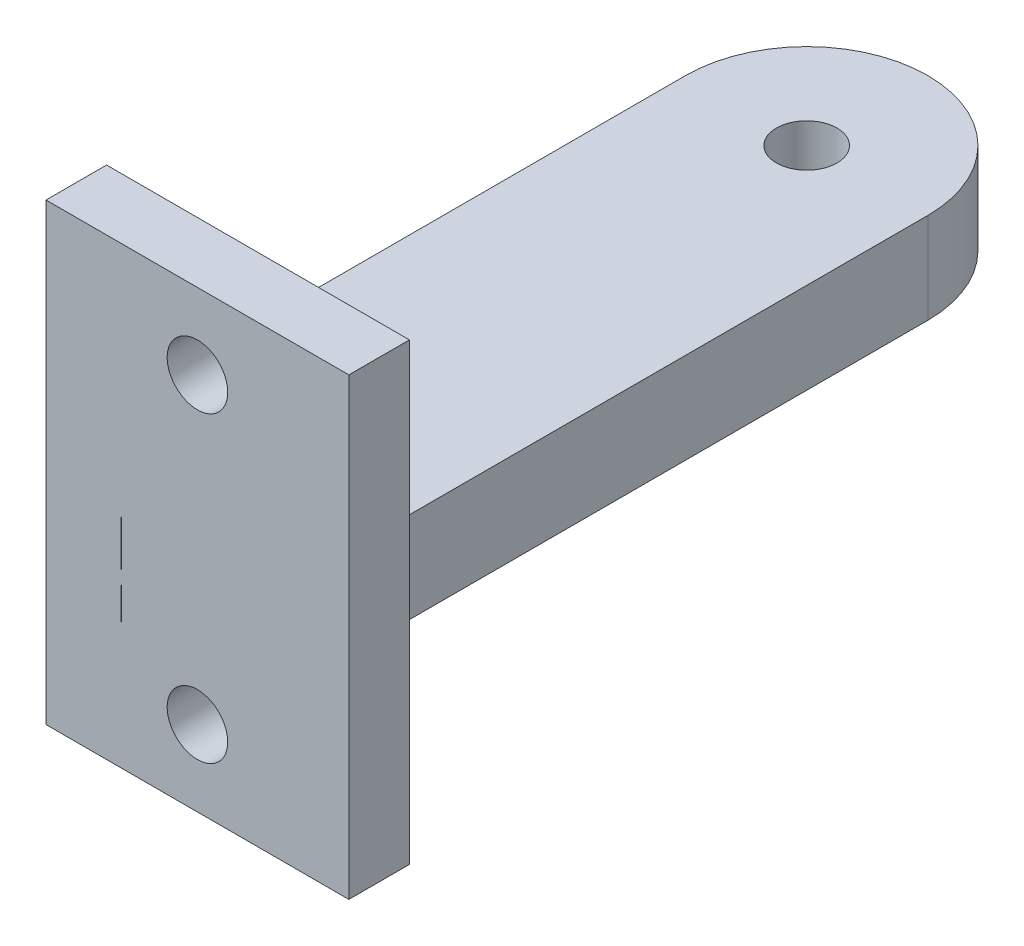
ISO-10303-21;
HEADER;
FILE_DESCRIPTION(('STEP AP214'),'2;1');
FILE_NAME('part.step','',(''),(''),'','','');
FILE_SCHEMA(('AUTOMOTIVE_DESIGN { 1 0 10303 214 1 1 1 1 }'));
ENDSEC;
DATA;
#1=APPLICATION_CONTEXT('core data for automotive mechanical design processes');
#2=APPLICATION_PROTOCOL_DEFINITION('international standard','automotive_design',2000,#1);
#3=PRODUCT_CONTEXT('',#1,'mechanical');
#4=PRODUCT('Part','Part','',(#3));
#5=PRODUCT_RELATED_PRODUCT_CATEGORY('part','',(#4));
#6=PRODUCT_DEFINITION_FORMATION('','',#4);
#7=PRODUCT_DEFINITION_CONTEXT('part definition',#1,'design');
#8=PRODUCT_DEFINITION('design','',#6,#7);
#9=PRODUCT_DEFINITION_SHAPE('','',#8);
#10=(LENGTH_UNIT() NAMED_UNIT(*) SI_UNIT(.MILLI.,.METRE.));
#11=(NAMED_UNIT(*) PLANE_ANGLE_UNIT() SI_UNIT($,.RADIAN.));
#12=(NAMED_UNIT(*) SI_UNIT($,.STERADIAN.) SOLID_ANGLE_UNIT());
#13=UNCERTAINTY_MEASURE_WITH_UNIT(LENGTH_MEASURE(1.E-05),#10,'distance_accuracy_value','');
#14=(GEOMETRIC_REPRESENTATION_CONTEXT(3) GLOBAL_UNCERTAINTY_ASSIGNED_CONTEXT((#13)) GLOBAL_UNIT_ASSIGNED_CONTEXT((#10,
#11,#12)) REPRESENTATION_CONTEXT('',''));
#15=CARTESIAN_POINT('',(0.,0.,0.));
#16=DIRECTION('',(0.,0.,1.));
#17=DIRECTION('',(1.,0.,0.));
#18=AXIS2_PLACEMENT_3D('',#15,#16,#17);
#19=CARTESIAN_POINT('',(0.,-3.,-0.233913739434797));
#20=DIRECTION('',(0.,1.,0.));
#21=DIRECTION('',(0.,0.,1.));
#22=AXIS2_PLACEMENT_3D('',#19,#20,#21);
#23=CYLINDRICAL_SURFACE('',#22,8.);
#24=DIRECTION('',(0.,1.,0.));
#25=VECTOR('',#24,1.);
#26=CARTESIAN_POINT('',(-1.36862294810169,-3.,7.64814634825354));
#27=LINE('',#26,#25);
#28=CARTESIAN_POINT('',(-1.36862294810169,-3.,7.64814634825354));
#29=VERTEX_POINT('',#28);
#30=CARTESIAN_POINT('',(-1.38161427696113,0.,7.64586849273672));
#31=VERTEX_POINT('',#30);
#32=EDGE_CURVE('E57',#29,#31,#27,.T.);
#33=ORIENTED_EDGE('',*,*,#32,.T.);
#34=DIRECTION('',(0.,1.,0.));
#35=VECTOR('',#34,1.);
#36=CARTESIAN_POINT('',(-1.39460560582057,-3.,7.6435906372199));
#37=LINE('',#36,#35);
#38=CARTESIAN_POINT('',(-1.39460560582057,-3.,7.6435906372199));
#39=VERTEX_POINT('',#38);
#40=EDGE_CURVE('E12',#39,#31,#37,.T.);
#41=ORIENTED_EDGE('',*,*,#40,.F.);
#42=CARTESIAN_POINT('',(0.,-3.,-0.233913739434797));
#43=DIRECTION('',(0.,1.,0.));
#44=DIRECTION('',(0.,0.,1.));
#45=AXIS2_PLACEMENT_3D('',#42,#43,#44);
#46=CIRCLE('',#45,8.);
#47=EDGE_CURVE('E69',#39,#29,#46,.T.);
#48=ORIENTED_EDGE('',*,*,#47,.T.);
#49=EDGE_LOOP('',(#33,#41,#48));
#50=FACE_BOUND('',#49,.T.);
#51=ADVANCED_FACE('F48',(#50),#23,.T.);
#52=CARTESIAN_POINT('',(-1.36862294810169,-3.,7.64814634825354));
#53=DIRECTION('',(0.172702019337558,0.,-0.984974117688749));
#54=DIRECTION('',(-0.984974117688749,0.,-0.172702019337558));
#55=AXIS2_PLACEMENT_3D('',#52,#53,#54);
#56=PLANE('',#55);
#57=ORIENTED_EDGE('',*,*,#40,.T.);
#58=ORIENTED_EDGE('',*,*,#32,.F.);
#59=DIRECTION('',(-0.984974117688749,0.,-0.172702019337558));
#60=VECTOR('',#59,1.);
#61=CARTESIAN_POINT('',(-1.36862294810169,-3.,7.64814634825354));
#62=LINE('',#61,#60);
#63=EDGE_CURVE('E71',#29,#39,#62,.T.);
#64=ORIENTED_EDGE('',*,*,#63,.T.);
#65=EDGE_LOOP('',(#57,#58,#64));
#66=FACE_BOUND('',#65,.T.);
#67=ADVANCED_FACE('F72',(#66),#56,.T.);
#68=CARTESIAN_POINT('',(0.,-3.,-0.233913739434797));
#69=DIRECTION('',(0.,1.,0.));
#70=DIRECTION('',(0.,0.,1.));
#71=AXIS2_PLACEMENT_3D('',#68,#69,#70);
#72=PLANE('',#71);
#73=ORIENTED_EDGE('',*,*,#47,.F.);
#74=ORIENTED_EDGE('',*,*,#63,.F.);
#75=EDGE_LOOP('',(#73,#74));
#76=FACE_BOUND('',#75,.T.);
#77=ADVANCED_FACE('F78',(#76),#72,.F.);
#78=CLOSED_SHELL('',(#51,#67,#77));
#79=MANIFOLD_SOLID_BREP('B2',#78);
#80=CARTESIAN_POINT('',(-8.,-3.,-0.233913739434797));
#81=DIRECTION('',(0.,0.,1.));
#82=DIRECTION('',(1.,0.,0.));
#83=AXIS2_PLACEMENT_3D('',#80,#81,#82);
#84=PLANE('',#83);
#85=DIRECTION('',(0.,1.,0.));
#86=VECTOR('',#85,1.);
#87=CARTESIAN_POINT('',(8.,-3.,-0.233913739434797));
#88=LINE('',#87,#86);
#89=CARTESIAN_POINT('',(8.,-3.,-0.233913739434797));
#90=VERTEX_POINT('',#89);
#91=CARTESIAN_POINT('',(8.,3.,-0.233913739434797));
#92=VERTEX_POINT('',#91);
#93=EDGE_CURVE('E117',#90,#92,#88,.T.);
#94=ORIENTED_EDGE('',*,*,#93,.T.);
#95=DIRECTION('',(1.,0.,0.));
#96=VECTOR('',#95,1.);
#97=CARTESIAN_POINT('',(-8.,3.,-0.233913739434797));
#98=LINE('',#97,#96);
#99=CARTESIAN_POINT('',(-8.,3.,-0.233913739434797));
#100=VERTEX_POINT('',#99);
#101=EDGE_CURVE('E154',#100,#92,#98,.T.);
#102=ORIENTED_EDGE('',*,*,#101,.F.);
#103=DIRECTION('',(0.,1.,0.));
#104=VECTOR('',#103,1.);
#105=CARTESIAN_POINT('',(-8.,-3.,-0.233913739434797));
#106=LINE('',#105,#104);
#107=CARTESIAN_POINT('',(-8.,-3.,-0.233913739434797));
#108=VERTEX_POINT('',#107);
#109=EDGE_CURVE('E46',#108,#100,#106,.T.);
#110=ORIENTED_EDGE('',*,*,#109,.F.);
#111=DIRECTION('',(1.,0.,0.));
#112=VECTOR('',#111,1.);
#113=CARTESIAN_POINT('',(-8.,-3.,-0.233913739434797));
#114=LINE('',#113,#112);
#115=EDGE_CURVE('E155',#108,#90,#114,.T.);
#116=ORIENTED_EDGE('',*,*,#115,.T.);
#117=EDGE_LOOP('',(#94,#102,#110,#116));
#118=FACE_BOUND('',#117,.T.);
#119=ADVANCED_FACE('F114',(#118),#84,.T.);
#120=CARTESIAN_POINT('',(-8.,-3.,-0.233913739434797));
#121=DIRECTION('',(-1.,0.,0.));
#122=DIRECTION('',(0.,0.,1.));
#123=AXIS2_PLACEMENT_3D('',#120,#121,#122);
#124=PLANE('',#123);
#125=ORIENTED_EDGE('',*,*,#109,.T.);
#126=DIRECTION('',(0.,0.,1.));
#127=VECTOR('',#126,1.);
#128=CARTESIAN_POINT('',(-8.,3.,-0.233913739434797));
#129=LINE('',#128,#127);
#130=CARTESIAN_POINT('',(-8.,3.,-36.2339137394348));
#131=VERTEX_POINT('',#130);
#132=EDGE_CURVE('E171',#131,#100,#129,.T.);
#133=ORIENTED_EDGE('',*,*,#132,.F.);
#134=DIRECTION('',(0.,1.,0.));
#135=VECTOR('',#134,1.);
#136=CARTESIAN_POINT('',(-8.,-3.,-36.2339137394348));
#137=LINE('',#136,#135);
#138=CARTESIAN_POINT('',(-8.,-3.,-36.2339137394348));
#139=VERTEX_POINT('',#138);
#140=EDGE_CURVE('E122',#139,#131,#137,.T.);
#141=ORIENTED_EDGE('',*,*,#140,.F.);
#142=DIRECTION('',(0.,0.,1.));
#143=VECTOR('',#142,1.);
#144=CARTESIAN_POINT('',(-8.,-3.,-0.233913739434797));
#145=LINE('',#144,#143);
#146=EDGE_CURVE('E160',#139,#108,#145,.T.);
#147=ORIENTED_EDGE('',*,*,#146,.T.);
#148=EDGE_LOOP('',(#125,#133,#141,#147));
#149=FACE_BOUND('',#148,.T.);
#150=ADVANCED_FACE('F191',(#149),#124,.T.);
#151=CARTESIAN_POINT('',(0.,-3.,-36.2339137394348));
#152=DIRECTION('',(0.,1.,0.));
#153=DIRECTION('',(0.,0.,1.));
#154=AXIS2_PLACEMENT_3D('',#151,#152,#153);
#155=CYLINDRICAL_SURFACE('',#154,8.);
#156=ORIENTED_EDGE('',*,*,#140,.T.);
#157=CARTESIAN_POINT('',(0.,3.,-36.2339137394348));
#158=DIRECTION('',(0.,1.,0.));
#159=DIRECTION('',(0.,0.,1.));
#160=AXIS2_PLACEMENT_3D('',#157,#158,#159);
#161=CIRCLE('',#160,8.);
#162=CARTESIAN_POINT('',(8.,3.,-36.2339137394348));
#163=VERTEX_POINT('',#162);
#164=EDGE_CURVE('E167',#163,#131,#161,.T.);
#165=ORIENTED_EDGE('',*,*,#164,.F.);
#166=DIRECTION('',(0.,1.,0.));
#167=VECTOR('',#166,1.);
#168=CARTESIAN_POINT('',(8.,-3.,-36.2339137394348));
#169=LINE('',#168,#167);
#170=CARTESIAN_POINT('',(8.,-3.,-36.2339137394348));
#171=VERTEX_POINT('',#170);
#172=EDGE_CURVE('E159',#171,#163,#169,.T.);
#173=ORIENTED_EDGE('',*,*,#172,.F.);
#174=CARTESIAN_POINT('',(0.,-3.,-36.2339137394348));
#175=DIRECTION('',(0.,1.,0.));
#176=DIRECTION('',(0.,0.,1.));
#177=AXIS2_PLACEMENT_3D('',#174,#175,#176);
#178=CIRCLE('',#177,8.);
#179=EDGE_CURVE('E184',#171,#139,#178,.T.);
#180=ORIENTED_EDGE('',*,*,#179,.T.);
#181=EDGE_LOOP('',(#156,#165,#173,#180));
#182=FACE_BOUND('',#181,.T.);
#183=ADVANCED_FACE('F188',(#182),#155,.T.);
#184=CARTESIAN_POINT('',(8.,-3.,-0.233913739434797));
#185=DIRECTION('',(1.,0.,0.));
#186=DIRECTION('',(0.,0.,-1.));
#187=AXIS2_PLACEMENT_3D('',#184,#185,#186);
#188=PLANE('',#187);
#189=ORIENTED_EDGE('',*,*,#172,.T.);
#190=DIRECTION('',(0.,0.,-1.));
#191=VECTOR('',#190,1.);
#192=CARTESIAN_POINT('',(8.,3.,-0.233913739434797));
#193=LINE('',#192,#191);
#194=EDGE_CURVE('E162',#92,#163,#193,.T.);
#195=ORIENTED_EDGE('',*,*,#194,.F.);
#196=ORIENTED_EDGE('',*,*,#93,.F.);
#197=DIRECTION('',(0.,0.,-1.));
#198=VECTOR('',#197,1.);
#199=CARTESIAN_POINT('',(8.,-3.,-0.233913739434797));
#200=LINE('',#199,#198);
#201=EDGE_CURVE('E182',#90,#171,#200,.T.);
#202=ORIENTED_EDGE('',*,*,#201,.T.);
#203=EDGE_LOOP('',(#189,#195,#196,#202));
#204=FACE_BOUND('',#203,.T.);
#205=ADVANCED_FACE('F163',(#204),#188,.T.);
#206=CARTESIAN_POINT('',(0.,-3.,-36.2339137394348));
#207=DIRECTION('',(0.,1.,0.));
#208=DIRECTION('',(0.,0.,1.));
#209=AXIS2_PLACEMENT_3D('',#206,#207,#208);
#210=PLANE('',#209);
#211=CARTESIAN_POINT('',(0.,-3.,-36.2339137394348));
#212=DIRECTION('',(0.,1.,0.));
#213=DIRECTION('',(0.,0.,1.));
#214=AXIS2_PLACEMENT_3D('',#211,#212,#213);
#215=CIRCLE('',#214,2.);
#216=CARTESIAN_POINT('',(0.,-3.,-34.2339137394348));
#217=VERTEX_POINT('',#216);
#218=EDGE_CURVE('E172',#217,#217,#215,.T.);
#219=ORIENTED_EDGE('',*,*,#218,.T.);
#220=EDGE_LOOP('',(#219));
#221=FACE_BOUND('',#220,.T.);
#222=ORIENTED_EDGE('',*,*,#115,.F.);
#223=ORIENTED_EDGE('',*,*,#146,.F.);
#224=ORIENTED_EDGE('',*,*,#179,.F.);
#225=ORIENTED_EDGE('',*,*,#201,.F.);
#226=EDGE_LOOP('',(#222,#223,#224,#225));
#227=FACE_BOUND('',#226,.T.);
#228=ADVANCED_FACE('F193',(#221,#227),#210,.F.);
#229=CARTESIAN_POINT('',(0.,3.,-36.2339137394348));
#230=DIRECTION('',(0.,1.,0.));
#231=DIRECTION('',(0.,0.,1.));
#232=AXIS2_PLACEMENT_3D('',#229,#230,#231);
#233=PLANE('',#232);
#234=CARTESIAN_POINT('',(0.,3.,-36.2339137394348));
#235=DIRECTION('',(0.,1.,0.));
#236=DIRECTION('',(0.,0.,1.));
#237=AXIS2_PLACEMENT_3D('',#234,#235,#236);
#238=CIRCLE('',#237,2.);
#239=CARTESIAN_POINT('',(0.,3.,-34.2339137394348));
#240=VERTEX_POINT('',#239);
#241=EDGE_CURVE('E175',#240,#240,#238,.T.);
#242=ORIENTED_EDGE('',*,*,#241,.F.);
#243=EDGE_LOOP('',(#242));
#244=FACE_BOUND('',#243,.T.);
#245=ORIENTED_EDGE('',*,*,#101,.T.);
#246=ORIENTED_EDGE('',*,*,#194,.T.);
#247=ORIENTED_EDGE('',*,*,#164,.T.);
#248=ORIENTED_EDGE('',*,*,#132,.T.);
#249=EDGE_LOOP('',(#245,#246,#247,#248));
#250=FACE_BOUND('',#249,.T.);
#251=ADVANCED_FACE('F170',(#244,#250),#233,.T.);
#252=CARTESIAN_POINT('',(0.,-15.,-36.2339137394348));
#253=DIRECTION('',(0.,1.,0.));
#254=DIRECTION('',(0.,0.,1.));
#255=AXIS2_PLACEMENT_3D('',#252,#253,#254);
#256=CYLINDRICAL_SURFACE('',#255,2.);
#257=ORIENTED_EDGE('',*,*,#241,.T.);
#258=EDGE_LOOP('',(#257));
#259=FACE_BOUND('',#258,.T.);
#260=ORIENTED_EDGE('',*,*,#218,.F.);
#261=EDGE_LOOP('',(#260));
#262=FACE_BOUND('',#261,.T.);
#263=ADVANCED_FACE('F201',(#259,#262),#256,.F.);
#264=CLOSED_SHELL('',(#119,#150,#183,#205,#228,#251,#263));
#265=MANIFOLD_SOLID_BREP('B6',#264);
#266=CARTESIAN_POINT('',(0.,3.,-0.233913739434797));
#267=DIRECTION('',(0.,-1.,0.));
#268=DIRECTION('',(0.,0.,-1.));
#269=AXIS2_PLACEMENT_3D('',#266,#267,#268);
#270=CYLINDRICAL_SURFACE('',#269,8.);
#271=CARTESIAN_POINT('',(0.,0.,-0.233913739434797));
#272=DIRECTION('',(0.,1.,0.));
#273=DIRECTION('',(0.,0.,1.));
#274=AXIS2_PLACEMENT_3D('',#271,#272,#273);
#275=CIRCLE('',#274,8.);
#276=CARTESIAN_POINT('',(-1.39460560582057,0.,7.6435906372199));
#277=VERTEX_POINT('',#276);
#278=CARTESIAN_POINT('',(-1.36862294810169,0.,7.64814634825354));
#279=VERTEX_POINT('',#278);
#280=EDGE_CURVE('E299',#277,#279,#275,.T.);
#281=ORIENTED_EDGE('',*,*,#280,.T.);
#282=DIRECTION('',(0.,-1.,0.));
#283=VECTOR('',#282,1.);
#284=CARTESIAN_POINT('',(-1.36862294810169,3.,7.64814634825354));
#285=LINE('',#284,#283);
#286=CARTESIAN_POINT('',(-1.36862294810169,3.,7.64814634825354));
#287=VERTEX_POINT('',#286);
#288=EDGE_CURVE('E112',#287,#279,#285,.T.);
#289=ORIENTED_EDGE('',*,*,#288,.F.);
#290=CARTESIAN_POINT('',(0.,3.,-0.233913739434797));
#291=DIRECTION('',(0.,1.,0.));
#292=DIRECTION('',(0.,0.,1.));
#293=AXIS2_PLACEMENT_3D('',#290,#291,#292);
#294=CIRCLE('',#293,8.);
#295=CARTESIAN_POINT('',(-1.39460560582057,3.,7.6435906372199));
#296=VERTEX_POINT('',#295);
#297=EDGE_CURVE('E298',#296,#287,#294,.T.);
#298=ORIENTED_EDGE('',*,*,#297,.F.);
#299=DIRECTION('',(0.,-1.,0.));
#300=VECTOR('',#299,1.);
#301=CARTESIAN_POINT('',(-1.39460560582057,3.,7.6435906372199));
#302=LINE('',#301,#300);
#303=EDGE_CURVE('E276',#296,#277,#302,.T.);
#304=ORIENTED_EDGE('',*,*,#303,.T.);
#305=EDGE_LOOP('',(#281,#289,#298,#304));
#306=FACE_BOUND('',#305,.T.);
#307=ADVANCED_FACE('F268',(#306),#270,.T.);
#308=CARTESIAN_POINT('',(-1.36862294810169,3.,7.64814634825354));
#309=DIRECTION('',(-0.172702019337558,0.,0.984974117688749));
#310=DIRECTION('',(0.984974117688749,0.,0.172702019337558));
#311=AXIS2_PLACEMENT_3D('',#308,#309,#310);
#312=PLANE('',#311);
#313=DIRECTION('',(-0.984974117688749,0.,-0.172702019337558));
#314=VECTOR('',#313,1.);
#315=CARTESIAN_POINT('',(-1.36862294810169,0.,7.64814634825354));
#316=LINE('',#315,#314);
#317=EDGE_CURVE('E291',#279,#277,#316,.T.);
#318=ORIENTED_EDGE('',*,*,#317,.T.);
#319=ORIENTED_EDGE('',*,*,#303,.F.);
#320=DIRECTION('',(-0.984974117688749,0.,-0.172702019337558));
#321=VECTOR('',#320,1.);
#322=CARTESIAN_POINT('',(-1.36862294810169,3.,7.64814634825354));
#323=LINE('',#322,#321);
#324=EDGE_CURVE('E283',#287,#296,#323,.T.);
#325=ORIENTED_EDGE('',*,*,#324,.F.);
#326=ORIENTED_EDGE('',*,*,#288,.T.);
#327=EDGE_LOOP('',(#318,#319,#325,#326));
#328=FACE_BOUND('',#327,.T.);
#329=ADVANCED_FACE('F294',(#328),#312,.F.);
#330=CARTESIAN_POINT('',(0.,3.,-0.233913739434797));
#331=DIRECTION('',(0.,1.,0.));
#332=DIRECTION('',(0.,0.,1.));
#333=AXIS2_PLACEMENT_3D('',#330,#331,#332);
#334=PLANE('',#333);
#335=ORIENTED_EDGE('',*,*,#297,.T.);
#336=ORIENTED_EDGE('',*,*,#324,.T.);
#337=EDGE_LOOP('',(#335,#336));
#338=FACE_BOUND('',#337,.T.);
#339=ADVANCED_FACE('F306',(#338),#334,.T.);
#340=CARTESIAN_POINT('',(0.,0.,-0.233913739434797));
#341=DIRECTION('',(0.,1.,0.));
#342=DIRECTION('',(0.,0.,1.));
#343=AXIS2_PLACEMENT_3D('',#340,#341,#342);
#344=PLANE('',#343);
#345=ORIENTED_EDGE('',*,*,#280,.F.);
#346=ORIENTED_EDGE('',*,*,#317,.F.);
#347=EDGE_LOOP('',(#345,#346));
#348=FACE_BOUND('',#347,.T.);
#349=ADVANCED_FACE('F302',(#348),#344,.F.);
#350=CLOSED_SHELL('',(#307,#329,#339,#349));
#351=MANIFOLD_SOLID_BREP('B40',#350);
#352=CARTESIAN_POINT('',(10.,15.,4.));
#353=DIRECTION('',(-1.,0.,0.));
#354=DIRECTION('',(0.,-1.,0.));
#355=AXIS2_PLACEMENT_3D('',#352,#353,#354);
#356=PLANE('',#355);
#357=DIRECTION('',(0.,1.,0.));
#358=VECTOR('',#357,1.);
#359=CARTESIAN_POINT('',(10.,15.,0.));
#360=LINE('',#359,#358);
#361=CARTESIAN_POINT('',(10.,-15.,0.));
#362=VERTEX_POINT('',#361);
#363=CARTESIAN_POINT('',(10.,15.,0.));
#364=VERTEX_POINT('',#363);
#365=EDGE_CURVE('E403',#362,#364,#360,.T.);
#366=ORIENTED_EDGE('',*,*,#365,.T.);
#367=DIRECTION('',(0.,0.,-1.));
#368=VECTOR('',#367,1.);
#369=CARTESIAN_POINT('',(10.,15.,4.));
#370=LINE('',#369,#368);
#371=CARTESIAN_POINT('',(10.,15.,4.));
#372=VERTEX_POINT('',#371);
#373=EDGE_CURVE('E266',#372,#364,#370,.T.);
#374=ORIENTED_EDGE('',*,*,#373,.F.);
#375=DIRECTION('',(0.,1.,0.));
#376=VECTOR('',#375,1.);
#377=CARTESIAN_POINT('',(10.,15.,4.));
#378=LINE('',#377,#376);
#379=CARTESIAN_POINT('',(10.,-15.,4.));
#380=VERTEX_POINT('',#379);
#381=EDGE_CURVE('E391',#380,#372,#378,.T.);
#382=ORIENTED_EDGE('',*,*,#381,.F.);
#383=DIRECTION('',(0.,0.,-1.));
#384=VECTOR('',#383,1.);
#385=CARTESIAN_POINT('',(10.,-15.,4.));
#386=LINE('',#385,#384);
#387=EDGE_CURVE('E399',#380,#362,#386,.T.);
#388=ORIENTED_EDGE('',*,*,#387,.T.);
#389=EDGE_LOOP('',(#366,#374,#382,#388));
#390=FACE_BOUND('',#389,.T.);
#391=ADVANCED_FACE('F340',(#390),#356,.F.);
#392=CARTESIAN_POINT('',(-10.,15.,4.));
#393=DIRECTION('',(0.,-1.,0.));
#394=DIRECTION('',(0.,0.,-1.));
#395=AXIS2_PLACEMENT_3D('',#392,#393,#394);
#396=PLANE('',#395);
#397=DIRECTION('',(-1.,0.,0.));
#398=VECTOR('',#397,1.);
#399=CARTESIAN_POINT('',(-10.,15.,0.));
#400=LINE('',#399,#398);
#401=CARTESIAN_POINT('',(-10.,15.,0.));
#402=VERTEX_POINT('',#401);
#403=EDGE_CURVE('E395',#364,#402,#400,.T.);
#404=ORIENTED_EDGE('',*,*,#403,.T.);
#405=DIRECTION('',(0.,0.,-1.));
#406=VECTOR('',#405,1.);
#407=CARTESIAN_POINT('',(-10.,15.,4.));
#408=LINE('',#407,#406);
#409=CARTESIAN_POINT('',(-10.,15.,4.));
#410=VERTEX_POINT('',#409);
#411=EDGE_CURVE('E348',#410,#402,#408,.T.);
#412=ORIENTED_EDGE('',*,*,#411,.F.);
#413=DIRECTION('',(-1.,0.,0.));
#414=VECTOR('',#413,1.);
#415=CARTESIAN_POINT('',(-10.,15.,4.));
#416=LINE('',#415,#414);
#417=EDGE_CURVE('E386',#372,#410,#416,.T.);
#418=ORIENTED_EDGE('',*,*,#417,.F.);
#419=ORIENTED_EDGE('',*,*,#373,.T.);
#420=EDGE_LOOP('',(#404,#412,#418,#419));
#421=FACE_BOUND('',#420,.T.);
#422=ADVANCED_FACE('F394',(#421),#396,.F.);
#423=CARTESIAN_POINT('',(-10.,15.,4.));
#424=DIRECTION('',(1.,0.,0.));
#425=DIRECTION('',(0.,1.,0.));
#426=AXIS2_PLACEMENT_3D('',#423,#424,#425);
#427=PLANE('',#426);
#428=DIRECTION('',(0.,-1.,0.));
#429=VECTOR('',#428,1.);
#430=CARTESIAN_POINT('',(-10.,15.,0.));
#431=LINE('',#430,#429);
#432=CARTESIAN_POINT('',(-10.,-15.,0.));
#433=VERTEX_POINT('',#432);
#434=EDGE_CURVE('E373',#402,#433,#431,.T.);
#435=ORIENTED_EDGE('',*,*,#434,.T.);
#436=DIRECTION('',(0.,0.,-1.));
#437=VECTOR('',#436,1.);
#438=CARTESIAN_POINT('',(-10.,-15.,4.));
#439=LINE('',#438,#437);
#440=CARTESIAN_POINT('',(-10.,-15.,4.));
#441=VERTEX_POINT('',#440);
#442=EDGE_CURVE('E396',#441,#433,#439,.T.);
#443=ORIENTED_EDGE('',*,*,#442,.F.);
#444=DIRECTION('',(0.,-1.,0.));
#445=VECTOR('',#444,1.);
#446=CARTESIAN_POINT('',(-10.,15.,4.));
#447=LINE('',#446,#445);
#448=EDGE_CURVE('E389',#410,#441,#447,.T.);
#449=ORIENTED_EDGE('',*,*,#448,.F.);
#450=ORIENTED_EDGE('',*,*,#411,.T.);
#451=EDGE_LOOP('',(#435,#443,#449,#450));
#452=FACE_BOUND('',#451,.T.);
#453=ADVANCED_FACE('F397',(#452),#427,.F.);
#454=CARTESIAN_POINT('',(-10.,-15.,4.));
#455=DIRECTION('',(0.,1.,0.));
#456=DIRECTION('',(0.,0.,1.));
#457=AXIS2_PLACEMENT_3D('',#454,#455,#456);
#458=PLANE('',#457);
#459=DIRECTION('',(1.,0.,0.));
#460=VECTOR('',#459,1.);
#461=CARTESIAN_POINT('',(-10.,-15.,0.));
#462=LINE('',#461,#460);
#463=EDGE_CURVE('E379',#433,#362,#462,.T.);
#464=ORIENTED_EDGE('',*,*,#463,.T.);
#465=ORIENTED_EDGE('',*,*,#387,.F.);
#466=DIRECTION('',(1.,0.,0.));
#467=VECTOR('',#466,1.);
#468=CARTESIAN_POINT('',(-10.,-15.,4.));
#469=LINE('',#468,#467);
#470=EDGE_CURVE('E356',#441,#380,#469,.T.);
#471=ORIENTED_EDGE('',*,*,#470,.F.);
#472=ORIENTED_EDGE('',*,*,#442,.T.);
#473=EDGE_LOOP('',(#464,#465,#471,#472));
#474=FACE_BOUND('',#473,.T.);
#475=ADVANCED_FACE('F411',(#474),#458,.F.);
#476=CARTESIAN_POINT('',(0.,0.,4.));
#477=DIRECTION('',(0.,0.,1.));
#478=DIRECTION('',(1.,0.,0.));
#479=AXIS2_PLACEMENT_3D('',#476,#477,#478);
#480=PLANE('',#479);
#481=CARTESIAN_POINT('',(0.,10.,4.));
#482=DIRECTION('',(0.,0.,1.));
#483=DIRECTION('',(-1.,0.,0.));
#484=AXIS2_PLACEMENT_3D('',#481,#482,#483);
#485=CIRCLE('',#484,2.);
#486=CARTESIAN_POINT('',(-2.,10.,4.));
#487=VERTEX_POINT('',#486);
#488=EDGE_CURVE('E422',#487,#487,#485,.T.);
#489=ORIENTED_EDGE('',*,*,#488,.F.);
#490=EDGE_LOOP('',(#489));
#491=FACE_BOUND('',#490,.T.);
#492=CARTESIAN_POINT('',(0.,-10.,4.));
#493=DIRECTION('',(0.,0.,1.));
#494=DIRECTION('',(1.,0.,0.));
#495=AXIS2_PLACEMENT_3D('',#492,#493,#494);
#496=CIRCLE('',#495,2.);
#497=CARTESIAN_POINT('',(2.,-10.,4.));
#498=VERTEX_POINT('',#497);
#499=EDGE_CURVE('E406',#498,#498,#496,.T.);
#500=ORIENTED_EDGE('',*,*,#499,.F.);
#501=EDGE_LOOP('',(#500));
#502=FACE_BOUND('',#501,.T.);
#503=ORIENTED_EDGE('',*,*,#381,.T.);
#504=ORIENTED_EDGE('',*,*,#417,.T.);
#505=ORIENTED_EDGE('',*,*,#448,.T.);
#506=ORIENTED_EDGE('',*,*,#470,.T.);
#507=EDGE_LOOP('',(#503,#504,#505,#506));
#508=FACE_BOUND('',#507,.T.);
#509=ADVANCED_FACE('F387',(#491,#502,#508),#480,.T.);
#510=CARTESIAN_POINT('',(0.,0.,0.));
#511=DIRECTION('',(0.,0.,1.));
#512=DIRECTION('',(1.,0.,0.));
#513=AXIS2_PLACEMENT_3D('',#510,#511,#512);
#514=PLANE('',#513);
#515=CARTESIAN_POINT('',(0.,10.,0.));
#516=DIRECTION('',(0.,0.,1.));
#517=DIRECTION('',(-1.,0.,0.));
#518=AXIS2_PLACEMENT_3D('',#515,#516,#517);
#519=CIRCLE('',#518,2.);
#520=CARTESIAN_POINT('',(-2.,10.,0.));
#521=VERTEX_POINT('',#520);
#522=EDGE_CURVE('E423',#521,#521,#519,.T.);
#523=ORIENTED_EDGE('',*,*,#522,.T.);
#524=EDGE_LOOP('',(#523));
#525=FACE_BOUND('',#524,.T.);
#526=CARTESIAN_POINT('',(0.,-10.,0.));
#527=DIRECTION('',(0.,0.,-1.));
#528=DIRECTION('',(-1.,0.,0.));
#529=AXIS2_PLACEMENT_3D('',#526,#527,#528);
#530=CIRCLE('',#529,2.);
#531=CARTESIAN_POINT('',(-2.,-10.,0.));
#532=VERTEX_POINT('',#531);
#533=EDGE_CURVE('E419',#532,#532,#530,.T.);
#534=ORIENTED_EDGE('',*,*,#533,.F.);
#535=EDGE_LOOP('',(#534));
#536=FACE_BOUND('',#535,.T.);
#537=ORIENTED_EDGE('',*,*,#365,.F.);
#538=ORIENTED_EDGE('',*,*,#463,.F.);
#539=ORIENTED_EDGE('',*,*,#434,.F.);
#540=ORIENTED_EDGE('',*,*,#403,.F.);
#541=EDGE_LOOP('',(#537,#538,#539,#540));
#542=FACE_BOUND('',#541,.T.);
#543=ADVANCED_FACE('F414',(#525,#536,#542),#514,.F.);
#544=CARTESIAN_POINT('',(0.,-10.,7.76181605737893));
#545=DIRECTION('',(0.,0.,-1.));
#546=DIRECTION('',(-1.,0.,0.));
#547=AXIS2_PLACEMENT_3D('',#544,#545,#546);
#548=CYLINDRICAL_SURFACE('',#547,2.);
#549=ORIENTED_EDGE('',*,*,#499,.T.);
#550=EDGE_LOOP('',(#549));
#551=FACE_BOUND('',#550,.T.);
#552=ORIENTED_EDGE('',*,*,#533,.T.);
#553=EDGE_LOOP('',(#552));
#554=FACE_BOUND('',#553,.T.);
#555=ADVANCED_FACE('F437',(#551,#554),#548,.F.);
#556=CARTESIAN_POINT('',(0.,10.,4.));
#557=DIRECTION('',(0.,0.,-1.));
#558=DIRECTION('',(-1.,0.,0.));
#559=AXIS2_PLACEMENT_3D('',#556,#557,#558);
#560=CYLINDRICAL_SURFACE('',#559,2.);
#561=ORIENTED_EDGE('',*,*,#488,.T.);
#562=EDGE_LOOP('',(#561));
#563=FACE_BOUND('',#562,.T.);
#564=ORIENTED_EDGE('',*,*,#522,.F.);
#565=EDGE_LOOP('',(#564));
#566=FACE_BOUND('',#565,.T.);
#567=ADVANCED_FACE('F429',(#563,#566),#560,.F.);
#568=CLOSED_SHELL('',(#391,#422,#453,#475,#509,#543,#555,#567));
#569=MANIFOLD_SOLID_BREP('B106',#568);
#570=ADVANCED_BREP_SHAPE_REPRESENTATION('',(#18,#79,#265,#351,#569),#14);
#571=SHAPE_DEFINITION_REPRESENTATION(#9,#570);
ENDSEC;
END-ISO-10303-21;
